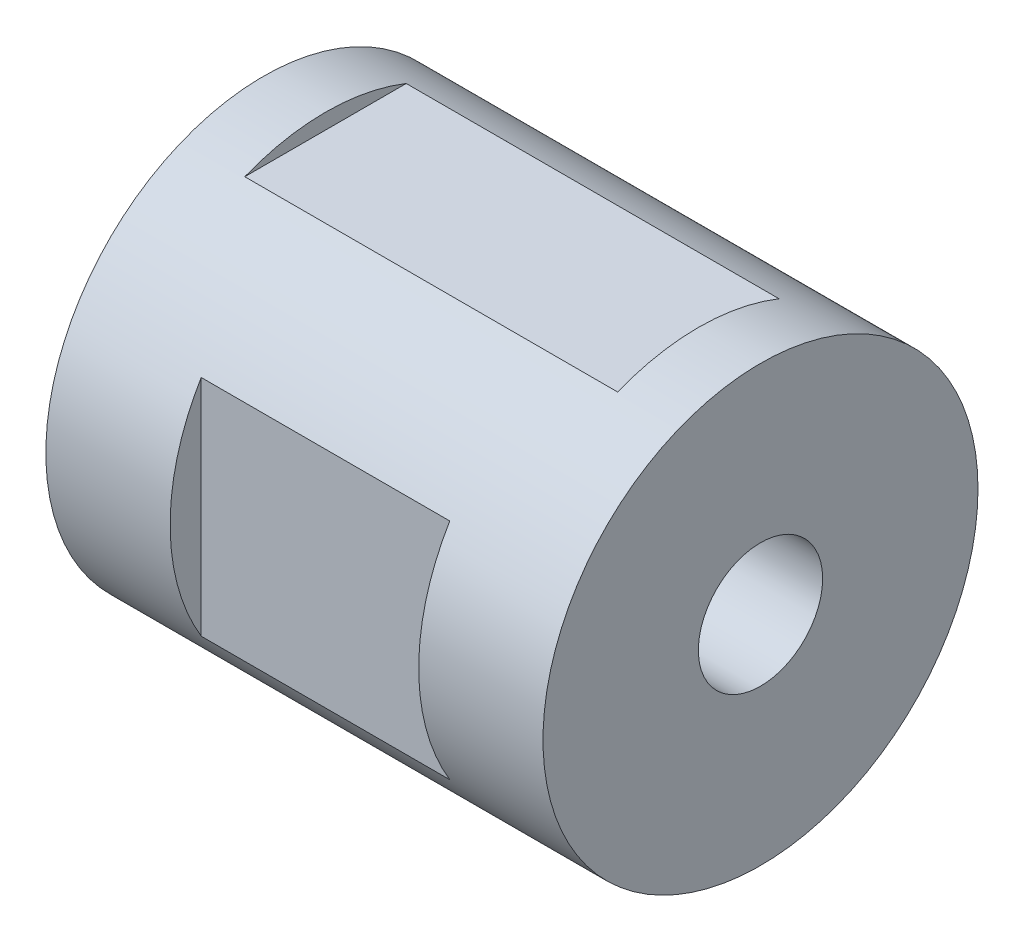
ISO-10303-21;
HEADER;
FILE_DESCRIPTION(('STEP AP214'),'2;1');
FILE_NAME('part.step','',(''),(''),'','','');
FILE_SCHEMA(('AUTOMOTIVE_DESIGN { 1 0 10303 214 1 1 1 1 }'));
ENDSEC;
DATA;
#1=APPLICATION_CONTEXT('core data for automotive mechanical design processes');
#2=APPLICATION_PROTOCOL_DEFINITION('international standard','automotive_design',2000,#1);
#3=PRODUCT_CONTEXT('',#1,'mechanical');
#4=PRODUCT('Part','Part','',(#3));
#5=PRODUCT_RELATED_PRODUCT_CATEGORY('part','',(#4));
#6=PRODUCT_DEFINITION_FORMATION('','',#4);
#7=PRODUCT_DEFINITION_CONTEXT('part definition',#1,'design');
#8=PRODUCT_DEFINITION('design','',#6,#7);
#9=PRODUCT_DEFINITION_SHAPE('','',#8);
#10=(LENGTH_UNIT() NAMED_UNIT(*) SI_UNIT(.MILLI.,.METRE.));
#11=(NAMED_UNIT(*) PLANE_ANGLE_UNIT() SI_UNIT($,.RADIAN.));
#12=(NAMED_UNIT(*) SI_UNIT($,.STERADIAN.) SOLID_ANGLE_UNIT());
#13=UNCERTAINTY_MEASURE_WITH_UNIT(LENGTH_MEASURE(1.E-05),#10,'distance_accuracy_value','');
#14=(GEOMETRIC_REPRESENTATION_CONTEXT(3) GLOBAL_UNCERTAINTY_ASSIGNED_CONTEXT((#13)) GLOBAL_UNIT_ASSIGNED_CONTEXT((#10,
#11,#12)) REPRESENTATION_CONTEXT('',''));
#15=CARTESIAN_POINT('',(0.,0.,0.));
#16=DIRECTION('',(0.,0.,1.));
#17=DIRECTION('',(1.,0.,0.));
#18=AXIS2_PLACEMENT_3D('',#15,#16,#17);
#19=CARTESIAN_POINT('',(-2032.,0.,0.));
#20=DIRECTION('',(1.,0.,0.));
#21=DIRECTION('',(0.,0.,-1.));
#22=AXIS2_PLACEMENT_3D('',#19,#20,#21);
#23=CYLINDRICAL_SURFACE('',#22,889.);
#24=CARTESIAN_POINT('',(-254.,0.,0.));
#25=DIRECTION('',(1.,0.,0.));
#26=DIRECTION('',(0.,0.,-1.));
#27=AXIS2_PLACEMENT_3D('',#24,#25,#26);
#28=CIRCLE('',#27,889.);
#29=CARTESIAN_POINT('',(-254.,825.50386860632,329.946000000001));
#30=VERTEX_POINT('',#29);
#31=CARTESIAN_POINT('',(-254.,825.50386860632,-329.946));
#32=VERTEX_POINT('',#31);
#33=EDGE_CURVE('E171',#30,#32,#28,.F.);
#34=ORIENTED_EDGE('',*,*,#33,.F.);
#35=DIRECTION('',(1.,0.,0.));
#36=VECTOR('',#35,1.);
#37=CARTESIAN_POINT('',(-2032.,825.50386860632,329.946000000001));
#38=LINE('',#37,#36);
#39=CARTESIAN_POINT('',(-1778.,825.50386860632,329.946000000001));
#40=VERTEX_POINT('',#39);
#41=EDGE_CURVE('E11',#40,#30,#38,.T.);
#42=ORIENTED_EDGE('',*,*,#41,.F.);
#43=CARTESIAN_POINT('',(-1778.,0.,0.));
#44=DIRECTION('',(-1.,0.,0.));
#45=DIRECTION('',(0.,0.,1.));
#46=AXIS2_PLACEMENT_3D('',#43,#44,#45);
#47=CIRCLE('',#46,889.);
#48=CARTESIAN_POINT('',(-1778.,825.50386860632,-329.946));
#49=VERTEX_POINT('',#48);
#50=EDGE_CURVE('E53',#49,#40,#47,.F.);
#51=ORIENTED_EDGE('',*,*,#50,.F.);
#52=DIRECTION('',(1.,0.,0.));
#53=VECTOR('',#52,1.);
#54=CARTESIAN_POINT('',(-2032.,825.50386860632,-329.946));
#55=LINE('',#54,#53);
#56=EDGE_CURVE('E174',#32,#49,#55,.F.);
#57=ORIENTED_EDGE('',*,*,#56,.F.);
#58=EDGE_LOOP('',(#34,#42,#51,#57));
#59=FACE_BOUND('',#58,.T.);
#60=DIRECTION('',(1.,0.,0.));
#61=VECTOR('',#60,1.);
#62=CARTESIAN_POINT('',(-2032.,-457.905011983927,762.));
#63=LINE('',#62,#61);
#64=CARTESIAN_POINT('',(-1524.,-457.905011983927,762.));
#65=VERTEX_POINT('',#64);
#66=CARTESIAN_POINT('',(-508.,-457.905011983927,762.));
#67=VERTEX_POINT('',#66);
#68=EDGE_CURVE('E167',#65,#67,#63,.T.);
#69=ORIENTED_EDGE('',*,*,#68,.F.);
#70=CARTESIAN_POINT('',(-1524.,0.,0.));
#71=DIRECTION('',(-1.,0.,0.));
#72=DIRECTION('',(0.,0.,1.));
#73=AXIS2_PLACEMENT_3D('',#70,#71,#72);
#74=CIRCLE('',#73,889.);
#75=CARTESIAN_POINT('',(-1524.,457.905011983927,762.));
#76=VERTEX_POINT('',#75);
#77=EDGE_CURVE('E66',#76,#65,#74,.F.);
#78=ORIENTED_EDGE('',*,*,#77,.F.);
#79=DIRECTION('',(1.,0.,0.));
#80=VECTOR('',#79,1.);
#81=CARTESIAN_POINT('',(-2032.,457.905011983927,762.));
#82=LINE('',#81,#80);
#83=CARTESIAN_POINT('',(-508.,457.905011983927,762.));
#84=VERTEX_POINT('',#83);
#85=EDGE_CURVE('E164',#84,#76,#82,.F.);
#86=ORIENTED_EDGE('',*,*,#85,.F.);
#87=CARTESIAN_POINT('',(-508.,0.,0.));
#88=DIRECTION('',(1.,0.,0.));
#89=DIRECTION('',(0.,1.,0.));
#90=AXIS2_PLACEMENT_3D('',#87,#88,#89);
#91=CIRCLE('',#90,889.);
#92=EDGE_CURVE('E156',#67,#84,#91,.F.);
#93=ORIENTED_EDGE('',*,*,#92,.F.);
#94=EDGE_LOOP('',(#69,#78,#86,#93));
#95=FACE_BOUND('',#94,.T.);
#96=CARTESIAN_POINT('',(-2032.,0.,0.));
#97=DIRECTION('',(1.,0.,0.));
#98=DIRECTION('',(0.,0.,-1.));
#99=AXIS2_PLACEMENT_3D('',#96,#97,#98);
#100=CIRCLE('',#99,889.);
#101=CARTESIAN_POINT('',(-2032.,0.,-889.));
#102=VERTEX_POINT('',#101);
#103=EDGE_CURVE('E152',#102,#102,#100,.T.);
#104=ORIENTED_EDGE('',*,*,#103,.T.);
#105=EDGE_LOOP('',(#104));
#106=FACE_BOUND('',#105,.T.);
#107=CARTESIAN_POINT('',(0.,0.,0.));
#108=DIRECTION('',(1.,0.,0.));
#109=DIRECTION('',(0.,0.,-1.));
#110=AXIS2_PLACEMENT_3D('',#107,#108,#109);
#111=CIRCLE('',#110,889.);
#112=CARTESIAN_POINT('',(0.,0.,-889.));
#113=VERTEX_POINT('',#112);
#114=EDGE_CURVE('E148',#113,#113,#111,.T.);
#115=ORIENTED_EDGE('',*,*,#114,.F.);
#116=EDGE_LOOP('',(#115));
#117=FACE_BOUND('',#116,.T.);
#118=ADVANCED_FACE('F45',(#59,#95,#106,#117),#23,.T.);
#119=CARTESIAN_POINT('',(-2032.,0.,0.));
#120=DIRECTION('',(1.,0.,0.));
#121=DIRECTION('',(0.,0.,-1.));
#122=AXIS2_PLACEMENT_3D('',#119,#120,#121);
#123=PLANE('',#122);
#124=CARTESIAN_POINT('',(-2032.,0.,0.));
#125=DIRECTION('',(1.,0.,0.));
#126=DIRECTION('',(0.,0.,-1.));
#127=AXIS2_PLACEMENT_3D('',#124,#125,#126);
#128=CIRCLE('',#127,254.);
#129=CARTESIAN_POINT('',(-2032.,0.,-254.));
#130=VERTEX_POINT('',#129);
#131=EDGE_CURVE('E144',#130,#130,#128,.T.);
#132=ORIENTED_EDGE('',*,*,#131,.T.);
#133=EDGE_LOOP('',(#132));
#134=FACE_BOUND('',#133,.T.);
#135=ORIENTED_EDGE('',*,*,#103,.F.);
#136=EDGE_LOOP('',(#135));
#137=FACE_BOUND('',#136,.T.);
#138=ADVANCED_FACE('F194',(#134,#137),#123,.F.);
#139=CARTESIAN_POINT('',(0.,0.,0.));
#140=DIRECTION('',(1.,0.,0.));
#141=DIRECTION('',(0.,0.,-1.));
#142=AXIS2_PLACEMENT_3D('',#139,#140,#141);
#143=PLANE('',#142);
#144=CARTESIAN_POINT('',(0.,0.,0.));
#145=DIRECTION('',(1.,0.,0.));
#146=DIRECTION('',(0.,0.,-1.));
#147=AXIS2_PLACEMENT_3D('',#144,#145,#146);
#148=CIRCLE('',#147,254.);
#149=CARTESIAN_POINT('',(0.,0.,-254.));
#150=VERTEX_POINT('',#149);
#151=EDGE_CURVE('E143',#150,#150,#148,.T.);
#152=ORIENTED_EDGE('',*,*,#151,.F.);
#153=EDGE_LOOP('',(#152));
#154=FACE_BOUND('',#153,.T.);
#155=ORIENTED_EDGE('',*,*,#114,.T.);
#156=EDGE_LOOP('',(#155));
#157=FACE_BOUND('',#156,.T.);
#158=ADVANCED_FACE('F200',(#154,#157),#143,.T.);
#159=CARTESIAN_POINT('',(-2032.,0.,0.));
#160=DIRECTION('',(1.,0.,0.));
#161=DIRECTION('',(0.,0.,-1.));
#162=AXIS2_PLACEMENT_3D('',#159,#160,#161);
#163=CYLINDRICAL_SURFACE('',#162,254.);
#164=ORIENTED_EDGE('',*,*,#131,.F.);
#165=EDGE_LOOP('',(#164));
#166=FACE_BOUND('',#165,.T.);
#167=ORIENTED_EDGE('',*,*,#151,.T.);
#168=EDGE_LOOP('',(#167));
#169=FACE_BOUND('',#168,.T.);
#170=ADVANCED_FACE('F206',(#166,#169),#163,.F.);
#171=CARTESIAN_POINT('',(-1524.,457.962,762.));
#172=DIRECTION('',(-1.,0.,0.));
#173=DIRECTION('',(0.,0.,1.));
#174=AXIS2_PLACEMENT_3D('',#171,#172,#173);
#175=PLANE('',#174);
#176=ORIENTED_EDGE('',*,*,#77,.T.);
#177=DIRECTION('',(0.,-1.,0.));
#178=VECTOR('',#177,1.);
#179=CARTESIAN_POINT('',(-1524.,457.962,762.));
#180=LINE('',#179,#178);
#181=EDGE_CURVE('E130',#76,#65,#180,.T.);
#182=ORIENTED_EDGE('',*,*,#181,.F.);
#183=EDGE_LOOP('',(#176,#182));
#184=FACE_BOUND('',#183,.T.);
#185=ADVANCED_FACE('F212',(#184),#175,.F.);
#186=CARTESIAN_POINT('',(-508.,457.962,762.));
#187=DIRECTION('',(1.,0.,0.));
#188=DIRECTION('',(0.,1.,0.));
#189=AXIS2_PLACEMENT_3D('',#186,#187,#188);
#190=PLANE('',#189);
#191=DIRECTION('',(0.,1.,0.));
#192=VECTOR('',#191,1.);
#193=CARTESIAN_POINT('',(-508.,457.962,762.));
#194=LINE('',#193,#192);
#195=EDGE_CURVE('E139',#67,#84,#194,.T.);
#196=ORIENTED_EDGE('',*,*,#195,.F.);
#197=ORIENTED_EDGE('',*,*,#92,.T.);
#198=EDGE_LOOP('',(#196,#197));
#199=FACE_BOUND('',#198,.T.);
#200=ADVANCED_FACE('F216',(#199),#190,.F.);
#201=CARTESIAN_POINT('',(0.,0.,762.));
#202=DIRECTION('',(0.,0.,-1.));
#203=DIRECTION('',(-1.,0.,0.));
#204=AXIS2_PLACEMENT_3D('',#201,#202,#203);
#205=PLANE('',#204);
#206=ORIENTED_EDGE('',*,*,#85,.T.);
#207=ORIENTED_EDGE('',*,*,#181,.T.);
#208=ORIENTED_EDGE('',*,*,#68,.T.);
#209=ORIENTED_EDGE('',*,*,#195,.T.);
#210=EDGE_LOOP('',(#206,#207,#208,#209));
#211=FACE_BOUND('',#210,.T.);
#212=ADVANCED_FACE('F219',(#211),#205,.F.);
#213=CARTESIAN_POINT('',(-1778.,825.5,-329.946));
#214=DIRECTION('',(-1.,0.,0.));
#215=DIRECTION('',(0.,0.,1.));
#216=AXIS2_PLACEMENT_3D('',#213,#214,#215);
#217=PLANE('',#216);
#218=DIRECTION('',(0.,1.,0.));
#219=VECTOR('',#218,1.);
#220=CARTESIAN_POINT('',(-1778.,825.5,-329.946));
#221=LINE('',#220,#219);
#222=CARTESIAN_POINT('',(-1778.,825.5,-329.946));
#223=VERTEX_POINT('',#222);
#224=EDGE_CURVE('E127',#223,#49,#221,.T.);
#225=ORIENTED_EDGE('',*,*,#224,.T.);
#226=ORIENTED_EDGE('',*,*,#50,.T.);
#227=DIRECTION('',(0.,1.,0.));
#228=VECTOR('',#227,1.);
#229=CARTESIAN_POINT('',(-1778.,825.5,329.946000000001));
#230=LINE('',#229,#228);
#231=CARTESIAN_POINT('',(-1778.,825.5,329.946000000001));
#232=VERTEX_POINT('',#231);
#233=EDGE_CURVE('E59',#232,#40,#230,.T.);
#234=ORIENTED_EDGE('',*,*,#233,.F.);
#235=DIRECTION('',(0.,0.,1.));
#236=VECTOR('',#235,1.);
#237=CARTESIAN_POINT('',(-1778.,825.5,-329.946));
#238=LINE('',#237,#236);
#239=EDGE_CURVE('E101',#223,#232,#238,.T.);
#240=ORIENTED_EDGE('',*,*,#239,.F.);
#241=EDGE_LOOP('',(#225,#226,#234,#240));
#242=FACE_BOUND('',#241,.T.);
#243=ADVANCED_FACE('F99',(#242),#217,.F.);
#244=CARTESIAN_POINT('',(-254.,825.5,-329.946));
#245=DIRECTION('',(0.,0.,-1.));
#246=DIRECTION('',(-1.,0.,0.));
#247=AXIS2_PLACEMENT_3D('',#244,#245,#246);
#248=PLANE('',#247);
#249=ORIENTED_EDGE('',*,*,#56,.T.);
#250=ORIENTED_EDGE('',*,*,#224,.F.);
#251=DIRECTION('',(-1.,0.,0.));
#252=VECTOR('',#251,1.);
#253=CARTESIAN_POINT('',(-254.,825.5,-329.946));
#254=LINE('',#253,#252);
#255=CARTESIAN_POINT('',(-254.,825.5,-329.946));
#256=VERTEX_POINT('',#255);
#257=EDGE_CURVE('E106',#256,#223,#254,.T.);
#258=ORIENTED_EDGE('',*,*,#257,.F.);
#259=DIRECTION('',(0.,1.,0.));
#260=VECTOR('',#259,1.);
#261=CARTESIAN_POINT('',(-254.,825.5,-329.946));
#262=LINE('',#261,#260);
#263=EDGE_CURVE('E131',#256,#32,#262,.T.);
#264=ORIENTED_EDGE('',*,*,#263,.T.);
#265=EDGE_LOOP('',(#249,#250,#258,#264));
#266=FACE_BOUND('',#265,.T.);
#267=ADVANCED_FACE('F180',(#266),#248,.F.);
#268=CARTESIAN_POINT('',(-254.,825.5,-329.946));
#269=DIRECTION('',(1.,0.,0.));
#270=DIRECTION('',(0.,0.,-1.));
#271=AXIS2_PLACEMENT_3D('',#268,#269,#270);
#272=PLANE('',#271);
#273=DIRECTION('',(0.,1.,0.));
#274=VECTOR('',#273,1.);
#275=CARTESIAN_POINT('',(-254.,825.5,329.946000000001));
#276=LINE('',#275,#274);
#277=CARTESIAN_POINT('',(-254.,825.5,329.946000000001));
#278=VERTEX_POINT('',#277);
#279=EDGE_CURVE('E105',#278,#30,#276,.T.);
#280=ORIENTED_EDGE('',*,*,#279,.T.);
#281=ORIENTED_EDGE('',*,*,#33,.T.);
#282=ORIENTED_EDGE('',*,*,#263,.F.);
#283=DIRECTION('',(0.,0.,-1.));
#284=VECTOR('',#283,1.);
#285=CARTESIAN_POINT('',(-254.,825.5,-329.946));
#286=LINE('',#285,#284);
#287=EDGE_CURVE('E116',#278,#256,#286,.T.);
#288=ORIENTED_EDGE('',*,*,#287,.F.);
#289=EDGE_LOOP('',(#280,#281,#282,#288));
#290=FACE_BOUND('',#289,.T.);
#291=ADVANCED_FACE('F184',(#290),#272,.F.);
#292=CARTESIAN_POINT('',(-254.,825.5,329.946000000001));
#293=DIRECTION('',(0.,0.,1.));
#294=DIRECTION('',(1.,0.,0.));
#295=AXIS2_PLACEMENT_3D('',#292,#293,#294);
#296=PLANE('',#295);
#297=ORIENTED_EDGE('',*,*,#41,.T.);
#298=ORIENTED_EDGE('',*,*,#279,.F.);
#299=DIRECTION('',(1.,0.,0.));
#300=VECTOR('',#299,1.);
#301=CARTESIAN_POINT('',(-254.,825.5,329.946000000001));
#302=LINE('',#301,#300);
#303=EDGE_CURVE('E109',#232,#278,#302,.T.);
#304=ORIENTED_EDGE('',*,*,#303,.F.);
#305=ORIENTED_EDGE('',*,*,#233,.T.);
#306=EDGE_LOOP('',(#297,#298,#304,#305));
#307=FACE_BOUND('',#306,.T.);
#308=ADVANCED_FACE('F110',(#307),#296,.F.);
#309=CARTESIAN_POINT('',(0.,825.5,0.));
#310=DIRECTION('',(0.,-1.,0.));
#311=DIRECTION('',(0.,0.,-1.));
#312=AXIS2_PLACEMENT_3D('',#309,#310,#311);
#313=PLANE('',#312);
#314=ORIENTED_EDGE('',*,*,#239,.T.);
#315=ORIENTED_EDGE('',*,*,#303,.T.);
#316=ORIENTED_EDGE('',*,*,#287,.T.);
#317=ORIENTED_EDGE('',*,*,#257,.T.);
#318=EDGE_LOOP('',(#314,#315,#316,#317));
#319=FACE_BOUND('',#318,.T.);
#320=ADVANCED_FACE('F118',(#319),#313,.F.);
#321=CLOSED_SHELL('',(#118,#138,#158,#170,#185,#200,#212,#243,#267,#291,#308,#320));
#322=MANIFOLD_SOLID_BREP('B2',#321);
#323=ADVANCED_BREP_SHAPE_REPRESENTATION('',(#18,#322),#14);
#324=SHAPE_DEFINITION_REPRESENTATION(#9,#323);
ENDSEC;
END-ISO-10303-21;
